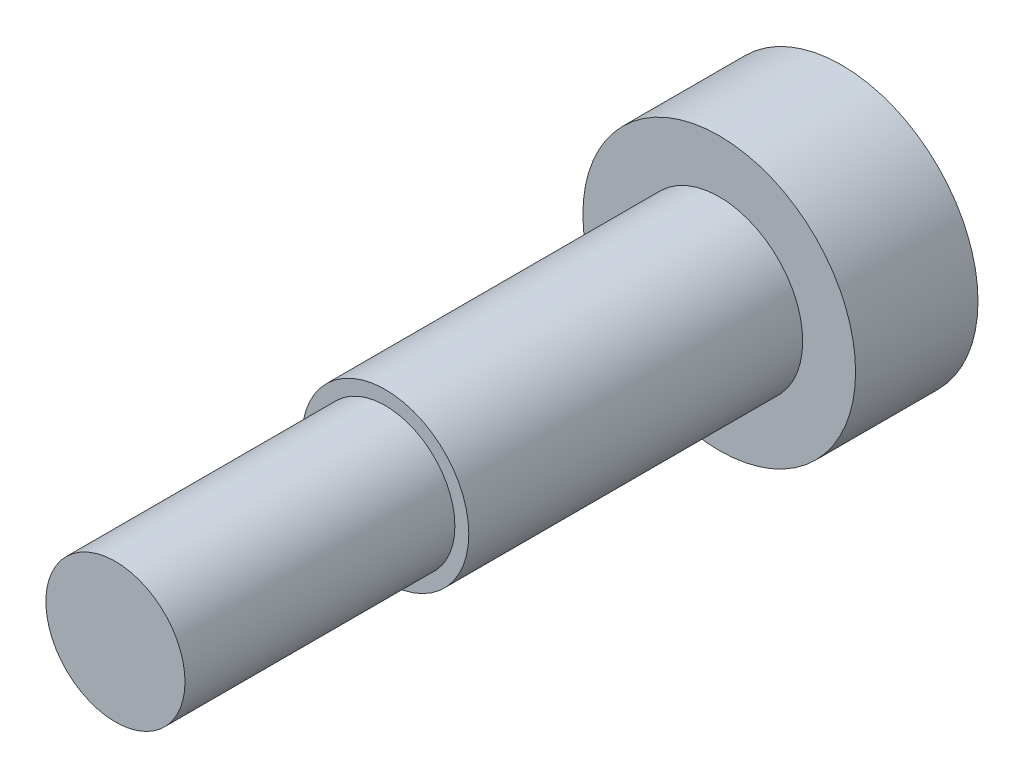
ISO-10303-21;
HEADER;
FILE_DESCRIPTION(('STEP AP214'),'2;1');
FILE_NAME('part.step','',(''),(''),'','','');
FILE_SCHEMA(('AUTOMOTIVE_DESIGN { 1 0 10303 214 1 1 1 1 }'));
ENDSEC;
DATA;
#1=APPLICATION_CONTEXT('core data for automotive mechanical design processes');
#2=APPLICATION_PROTOCOL_DEFINITION('international standard','automotive_design',2000,#1);
#3=PRODUCT_CONTEXT('',#1,'mechanical');
#4=PRODUCT('Part','Part','',(#3));
#5=PRODUCT_RELATED_PRODUCT_CATEGORY('part','',(#4));
#6=PRODUCT_DEFINITION_FORMATION('','',#4);
#7=PRODUCT_DEFINITION_CONTEXT('part definition',#1,'design');
#8=PRODUCT_DEFINITION('design','',#6,#7);
#9=PRODUCT_DEFINITION_SHAPE('','',#8);
#10=(LENGTH_UNIT() NAMED_UNIT(*) SI_UNIT(.MILLI.,.METRE.));
#11=(NAMED_UNIT(*) PLANE_ANGLE_UNIT() SI_UNIT($,.RADIAN.));
#12=(NAMED_UNIT(*) SI_UNIT($,.STERADIAN.) SOLID_ANGLE_UNIT());
#13=UNCERTAINTY_MEASURE_WITH_UNIT(LENGTH_MEASURE(1.E-05),#10,'distance_accuracy_value','');
#14=(GEOMETRIC_REPRESENTATION_CONTEXT(3) GLOBAL_UNCERTAINTY_ASSIGNED_CONTEXT((#13)) GLOBAL_UNIT_ASSIGNED_CONTEXT((#10,
#11,#12)) REPRESENTATION_CONTEXT('',''));
#15=CARTESIAN_POINT('',(0.,0.,0.));
#16=DIRECTION('',(0.,0.,1.));
#17=DIRECTION('',(1.,0.,0.));
#18=AXIS2_PLACEMENT_3D('',#15,#16,#17);
#19=CARTESIAN_POINT('',(0.,0.,4.4));
#20=DIRECTION('',(0.,0.,-1.));
#21=DIRECTION('',(-1.,0.,0.));
#22=AXIS2_PLACEMENT_3D('',#19,#20,#21);
#23=CYLINDRICAL_SURFACE('',#22,4.9);
#24=CARTESIAN_POINT('',(0.,0.,4.4));
#25=DIRECTION('',(0.,0.,1.));
#26=DIRECTION('',(1.,0.,0.));
#27=AXIS2_PLACEMENT_3D('',#24,#25,#26);
#28=CIRCLE('',#27,4.9);
#29=CARTESIAN_POINT('',(4.9,0.,4.4));
#30=VERTEX_POINT('',#29);
#31=EDGE_CURVE('E152',#30,#30,#28,.T.);
#32=ORIENTED_EDGE('',*,*,#31,.F.);
#33=EDGE_LOOP('',(#32));
#34=FACE_BOUND('',#33,.T.);
#35=CARTESIAN_POINT('',(0.,0.,0.));
#36=DIRECTION('',(0.,0.,1.));
#37=DIRECTION('',(1.,0.,0.));
#38=AXIS2_PLACEMENT_3D('',#35,#36,#37);
#39=CIRCLE('',#38,4.9);
#40=CARTESIAN_POINT('',(4.9,0.,0.));
#41=VERTEX_POINT('',#40);
#42=EDGE_CURVE('E40',#41,#41,#39,.T.);
#43=ORIENTED_EDGE('',*,*,#42,.T.);
#44=EDGE_LOOP('',(#43));
#45=FACE_BOUND('',#44,.T.);
#46=ADVANCED_FACE('F37',(#34,#45),#23,.T.);
#47=CARTESIAN_POINT('',(0.,0.,4.4));
#48=DIRECTION('',(0.,0.,1.));
#49=DIRECTION('',(1.,0.,0.));
#50=AXIS2_PLACEMENT_3D('',#47,#48,#49);
#51=PLANE('',#50);
#52=CARTESIAN_POINT('',(0.,0.,4.4));
#53=DIRECTION('',(0.,0.,1.));
#54=DIRECTION('',(1.,0.,0.));
#55=AXIS2_PLACEMENT_3D('',#52,#53,#54);
#56=CIRCLE('',#55,3.);
#57=CARTESIAN_POINT('',(3.,0.,4.4));
#58=VERTEX_POINT('',#57);
#59=EDGE_CURVE('E45',#58,#58,#56,.T.);
#60=ORIENTED_EDGE('',*,*,#59,.F.);
#61=EDGE_LOOP('',(#60));
#62=FACE_BOUND('',#61,.T.);
#63=ORIENTED_EDGE('',*,*,#31,.T.);
#64=EDGE_LOOP('',(#63));
#65=FACE_BOUND('',#64,.T.);
#66=ADVANCED_FACE('F163',(#62,#65),#51,.T.);
#67=CARTESIAN_POINT('',(0.,0.,0.));
#68=DIRECTION('',(0.,0.,1.));
#69=DIRECTION('',(1.,0.,0.));
#70=AXIS2_PLACEMENT_3D('',#67,#68,#69);
#71=PLANE('',#70);
#72=DIRECTION('',(0.866025403784439,-0.5,0.));
#73=VECTOR('',#72,1.);
#74=CARTESIAN_POINT('',(0.,1.73205080756888,0.));
#75=LINE('',#74,#73);
#76=CARTESIAN_POINT('',(0.,1.73205080756888,0.));
#77=VERTEX_POINT('',#76);
#78=CARTESIAN_POINT('',(1.5,0.866025403784438,0.));
#79=VERTEX_POINT('',#78);
#80=EDGE_CURVE('E127',#77,#79,#75,.T.);
#81=ORIENTED_EDGE('',*,*,#80,.F.);
#82=DIRECTION('',(0.866025403784439,0.5,0.));
#83=VECTOR('',#82,1.);
#84=CARTESIAN_POINT('',(-1.5,0.866025403784439,0.));
#85=LINE('',#84,#83);
#86=CARTESIAN_POINT('',(-1.5,0.866025403784439,0.));
#87=VERTEX_POINT('',#86);
#88=EDGE_CURVE('E53',#87,#77,#85,.T.);
#89=ORIENTED_EDGE('',*,*,#88,.F.);
#90=DIRECTION('',(0.,1.,0.));
#91=VECTOR('',#90,1.);
#92=CARTESIAN_POINT('',(-1.5,-0.866025403784441,0.));
#93=LINE('',#92,#91);
#94=CARTESIAN_POINT('',(-1.5,-0.866025403784441,0.));
#95=VERTEX_POINT('',#94);
#96=EDGE_CURVE('E136',#95,#87,#93,.T.);
#97=ORIENTED_EDGE('',*,*,#96,.F.);
#98=DIRECTION('',(-0.866025403784439,0.5,0.));
#99=VECTOR('',#98,1.);
#100=CARTESIAN_POINT('',(0.,-1.73205080756888,0.));
#101=LINE('',#100,#99);
#102=CARTESIAN_POINT('',(0.,-1.73205080756888,0.));
#103=VERTEX_POINT('',#102);
#104=EDGE_CURVE('E134',#103,#95,#101,.T.);
#105=ORIENTED_EDGE('',*,*,#104,.F.);
#106=DIRECTION('',(-0.866025403784438,-0.5,0.));
#107=VECTOR('',#106,1.);
#108=CARTESIAN_POINT('',(1.5,-0.86602540378444,0.));
#109=LINE('',#108,#107);
#110=CARTESIAN_POINT('',(1.5,-0.86602540378444,0.));
#111=VERTEX_POINT('',#110);
#112=EDGE_CURVE('E101',#111,#103,#109,.T.);
#113=ORIENTED_EDGE('',*,*,#112,.F.);
#114=DIRECTION('',(0.,-1.,0.));
#115=VECTOR('',#114,1.);
#116=CARTESIAN_POINT('',(1.5,0.866025403784438,0.));
#117=LINE('',#116,#115);
#118=EDGE_CURVE('E130',#79,#111,#117,.T.);
#119=ORIENTED_EDGE('',*,*,#118,.F.);
#120=EDGE_LOOP('',(#81,#89,#97,#105,#113,#119));
#121=FACE_BOUND('',#120,.T.);
#122=ORIENTED_EDGE('',*,*,#42,.F.);
#123=EDGE_LOOP('',(#122));
#124=FACE_BOUND('',#123,.T.);
#125=ADVANCED_FACE('F160',(#121,#124),#71,.F.);
#126=CARTESIAN_POINT('',(0.,0.,16.4));
#127=DIRECTION('',(0.,0.,-1.));
#128=DIRECTION('',(-1.,0.,0.));
#129=AXIS2_PLACEMENT_3D('',#126,#127,#128);
#130=CYLINDRICAL_SURFACE('',#129,3.);
#131=CARTESIAN_POINT('',(0.,0.,16.4));
#132=DIRECTION('',(0.,0.,1.));
#133=DIRECTION('',(1.,0.,0.));
#134=AXIS2_PLACEMENT_3D('',#131,#132,#133);
#135=CIRCLE('',#134,3.);
#136=CARTESIAN_POINT('',(3.,0.,16.4));
#137=VERTEX_POINT('',#136);
#138=EDGE_CURVE('E147',#137,#137,#135,.T.);
#139=ORIENTED_EDGE('',*,*,#138,.F.);
#140=EDGE_LOOP('',(#139));
#141=FACE_BOUND('',#140,.T.);
#142=ORIENTED_EDGE('',*,*,#59,.T.);
#143=EDGE_LOOP('',(#142));
#144=FACE_BOUND('',#143,.T.);
#145=ADVANCED_FACE('F162',(#141,#144),#130,.T.);
#146=CARTESIAN_POINT('',(0.,0.,16.4));
#147=DIRECTION('',(0.,0.,1.));
#148=DIRECTION('',(1.,0.,0.));
#149=AXIS2_PLACEMENT_3D('',#146,#147,#148);
#150=PLANE('',#149);
#151=CARTESIAN_POINT('',(0.,0.,16.4));
#152=DIRECTION('',(0.,0.,1.));
#153=DIRECTION('',(1.,0.,0.));
#154=AXIS2_PLACEMENT_3D('',#151,#152,#153);
#155=CIRCLE('',#154,2.5);
#156=CARTESIAN_POINT('',(2.5,0.,16.4));
#157=VERTEX_POINT('',#156);
#158=EDGE_CURVE('E11',#157,#157,#155,.T.);
#159=ORIENTED_EDGE('',*,*,#158,.F.);
#160=EDGE_LOOP('',(#159));
#161=FACE_BOUND('',#160,.T.);
#162=ORIENTED_EDGE('',*,*,#138,.T.);
#163=EDGE_LOOP('',(#162));
#164=FACE_BOUND('',#163,.T.);
#165=ADVANCED_FACE('F170',(#161,#164),#150,.T.);
#166=CARTESIAN_POINT('',(0.,0.,26.1));
#167=DIRECTION('',(0.,0.,-1.));
#168=DIRECTION('',(-1.,0.,0.));
#169=AXIS2_PLACEMENT_3D('',#166,#167,#168);
#170=CYLINDRICAL_SURFACE('',#169,2.5);
#171=CARTESIAN_POINT('',(0.,0.,26.1));
#172=DIRECTION('',(0.,0.,1.));
#173=DIRECTION('',(1.,0.,0.));
#174=AXIS2_PLACEMENT_3D('',#171,#172,#173);
#175=CIRCLE('',#174,2.5);
#176=CARTESIAN_POINT('',(2.5,0.,26.1));
#177=VERTEX_POINT('',#176);
#178=EDGE_CURVE('E140',#177,#177,#175,.T.);
#179=ORIENTED_EDGE('',*,*,#178,.F.);
#180=EDGE_LOOP('',(#179));
#181=FACE_BOUND('',#180,.T.);
#182=ORIENTED_EDGE('',*,*,#158,.T.);
#183=EDGE_LOOP('',(#182));
#184=FACE_BOUND('',#183,.T.);
#185=ADVANCED_FACE('F195',(#181,#184),#170,.T.);
#186=CARTESIAN_POINT('',(0.,0.,26.1));
#187=DIRECTION('',(0.,0.,1.));
#188=DIRECTION('',(1.,0.,0.));
#189=AXIS2_PLACEMENT_3D('',#186,#187,#188);
#190=PLANE('',#189);
#191=ORIENTED_EDGE('',*,*,#178,.T.);
#192=EDGE_LOOP('',(#191));
#193=FACE_BOUND('',#192,.T.);
#194=ADVANCED_FACE('F202',(#193),#190,.T.);
#195=CARTESIAN_POINT('',(-1.5,0.866025403784439,2.));
#196=DIRECTION('',(-0.5,0.866025403784439,0.));
#197=DIRECTION('',(-0.866025403784439,-0.5,0.));
#198=AXIS2_PLACEMENT_3D('',#195,#196,#197);
#199=PLANE('',#198);
#200=ORIENTED_EDGE('',*,*,#88,.T.);
#201=DIRECTION('',(0.,0.,-1.));
#202=VECTOR('',#201,1.);
#203=CARTESIAN_POINT('',(0.,1.73205080756888,2.));
#204=LINE('',#203,#202);
#205=CARTESIAN_POINT('',(0.,1.73205080756888,2.));
#206=VERTEX_POINT('',#205);
#207=EDGE_CURVE('E83',#206,#77,#204,.T.);
#208=ORIENTED_EDGE('',*,*,#207,.F.);
#209=DIRECTION('',(0.866025403784439,0.5,0.));
#210=VECTOR('',#209,1.);
#211=CARTESIAN_POINT('',(-1.5,0.866025403784439,2.));
#212=LINE('',#211,#210);
#213=CARTESIAN_POINT('',(-1.5,0.866025403784439,2.));
#214=VERTEX_POINT('',#213);
#215=EDGE_CURVE('E138',#214,#206,#212,.T.);
#216=ORIENTED_EDGE('',*,*,#215,.F.);
#217=DIRECTION('',(0.,0.,-1.));
#218=VECTOR('',#217,1.);
#219=CARTESIAN_POINT('',(-1.5,0.866025403784439,2.));
#220=LINE('',#219,#218);
#221=EDGE_CURVE('E61',#214,#87,#220,.T.);
#222=ORIENTED_EDGE('',*,*,#221,.T.);
#223=EDGE_LOOP('',(#200,#208,#216,#222));
#224=FACE_BOUND('',#223,.T.);
#225=ADVANCED_FACE('F209',(#224),#199,.F.);
#226=CARTESIAN_POINT('',(-1.5,-0.866025403784441,2.));
#227=DIRECTION('',(-1.,0.,0.));
#228=DIRECTION('',(0.,0.,1.));
#229=AXIS2_PLACEMENT_3D('',#226,#227,#228);
#230=PLANE('',#229);
#231=ORIENTED_EDGE('',*,*,#96,.T.);
#232=ORIENTED_EDGE('',*,*,#221,.F.);
#233=DIRECTION('',(0.,1.,0.));
#234=VECTOR('',#233,1.);
#235=CARTESIAN_POINT('',(-1.5,-0.866025403784441,2.));
#236=LINE('',#235,#234);
#237=CARTESIAN_POINT('',(-1.5,-0.866025403784441,2.));
#238=VERTEX_POINT('',#237);
#239=EDGE_CURVE('E113',#238,#214,#236,.T.);
#240=ORIENTED_EDGE('',*,*,#239,.F.);
#241=DIRECTION('',(0.,0.,-1.));
#242=VECTOR('',#241,1.);
#243=CARTESIAN_POINT('',(-1.5,-0.866025403784441,2.));
#244=LINE('',#243,#242);
#245=EDGE_CURVE('E105',#238,#95,#244,.T.);
#246=ORIENTED_EDGE('',*,*,#245,.T.);
#247=EDGE_LOOP('',(#231,#232,#240,#246));
#248=FACE_BOUND('',#247,.T.);
#249=ADVANCED_FACE('F218',(#248),#230,.F.);
#250=CARTESIAN_POINT('',(0.,-1.73205080756888,2.));
#251=DIRECTION('',(-0.5,-0.866025403784439,0.));
#252=DIRECTION('',(0.866025403784439,-0.5,0.));
#253=AXIS2_PLACEMENT_3D('',#250,#251,#252);
#254=PLANE('',#253);
#255=ORIENTED_EDGE('',*,*,#104,.T.);
#256=ORIENTED_EDGE('',*,*,#245,.F.);
#257=DIRECTION('',(-0.866025403784439,0.5,0.));
#258=VECTOR('',#257,1.);
#259=CARTESIAN_POINT('',(0.,-1.73205080756888,2.));
#260=LINE('',#259,#258);
#261=CARTESIAN_POINT('',(0.,-1.73205080756888,2.));
#262=VERTEX_POINT('',#261);
#263=EDGE_CURVE('E109',#262,#238,#260,.T.);
#264=ORIENTED_EDGE('',*,*,#263,.F.);
#265=DIRECTION('',(0.,0.,-1.));
#266=VECTOR('',#265,1.);
#267=CARTESIAN_POINT('',(0.,-1.73205080756888,2.));
#268=LINE('',#267,#266);
#269=EDGE_CURVE('E94',#262,#103,#268,.T.);
#270=ORIENTED_EDGE('',*,*,#269,.T.);
#271=EDGE_LOOP('',(#255,#256,#264,#270));
#272=FACE_BOUND('',#271,.T.);
#273=ADVANCED_FACE('F110',(#272),#254,.F.);
#274=CARTESIAN_POINT('',(1.5,-0.86602540378444,2.));
#275=DIRECTION('',(0.5,-0.866025403784438,0.));
#276=DIRECTION('',(0.866025403784439,0.5,0.));
#277=AXIS2_PLACEMENT_3D('',#274,#275,#276);
#278=PLANE('',#277);
#279=ORIENTED_EDGE('',*,*,#112,.T.);
#280=ORIENTED_EDGE('',*,*,#269,.F.);
#281=DIRECTION('',(-0.866025403784438,-0.5,0.));
#282=VECTOR('',#281,1.);
#283=CARTESIAN_POINT('',(1.5,-0.86602540378444,2.));
#284=LINE('',#283,#282);
#285=CARTESIAN_POINT('',(1.5,-0.86602540378444,2.));
#286=VERTEX_POINT('',#285);
#287=EDGE_CURVE('E98',#286,#262,#284,.T.);
#288=ORIENTED_EDGE('',*,*,#287,.F.);
#289=DIRECTION('',(0.,0.,-1.));
#290=VECTOR('',#289,1.);
#291=CARTESIAN_POINT('',(1.5,-0.86602540378444,2.));
#292=LINE('',#291,#290);
#293=EDGE_CURVE('E106',#286,#111,#292,.T.);
#294=ORIENTED_EDGE('',*,*,#293,.T.);
#295=EDGE_LOOP('',(#279,#280,#288,#294));
#296=FACE_BOUND('',#295,.T.);
#297=ADVANCED_FACE('F96',(#296),#278,.F.);
#298=CARTESIAN_POINT('',(1.5,0.866025403784438,2.));
#299=DIRECTION('',(1.,0.,0.));
#300=DIRECTION('',(0.,1.,0.));
#301=AXIS2_PLACEMENT_3D('',#298,#299,#300);
#302=PLANE('',#301);
#303=ORIENTED_EDGE('',*,*,#118,.T.);
#304=ORIENTED_EDGE('',*,*,#293,.F.);
#305=DIRECTION('',(0.,-1.,0.));
#306=VECTOR('',#305,1.);
#307=CARTESIAN_POINT('',(1.5,0.866025403784438,2.));
#308=LINE('',#307,#306);
#309=CARTESIAN_POINT('',(1.5,0.866025403784438,2.));
#310=VERTEX_POINT('',#309);
#311=EDGE_CURVE('E119',#310,#286,#308,.T.);
#312=ORIENTED_EDGE('',*,*,#311,.F.);
#313=DIRECTION('',(0.,0.,-1.));
#314=VECTOR('',#313,1.);
#315=CARTESIAN_POINT('',(1.5,0.866025403784438,2.));
#316=LINE('',#315,#314);
#317=EDGE_CURVE('E143',#310,#79,#316,.T.);
#318=ORIENTED_EDGE('',*,*,#317,.T.);
#319=EDGE_LOOP('',(#303,#304,#312,#318));
#320=FACE_BOUND('',#319,.T.);
#321=ADVANCED_FACE('F237',(#320),#302,.F.);
#322=CARTESIAN_POINT('',(0.,1.73205080756888,2.));
#323=DIRECTION('',(0.5,0.866025403784439,0.));
#324=DIRECTION('',(-0.866025403784439,0.5,0.));
#325=AXIS2_PLACEMENT_3D('',#322,#323,#324);
#326=PLANE('',#325);
#327=ORIENTED_EDGE('',*,*,#80,.T.);
#328=ORIENTED_EDGE('',*,*,#317,.F.);
#329=DIRECTION('',(0.866025403784439,-0.5,0.));
#330=VECTOR('',#329,1.);
#331=CARTESIAN_POINT('',(0.,1.73205080756888,2.));
#332=LINE('',#331,#330);
#333=EDGE_CURVE('E121',#206,#310,#332,.T.);
#334=ORIENTED_EDGE('',*,*,#333,.F.);
#335=ORIENTED_EDGE('',*,*,#207,.T.);
#336=EDGE_LOOP('',(#327,#328,#334,#335));
#337=FACE_BOUND('',#336,.T.);
#338=ADVANCED_FACE('F244',(#337),#326,.F.);
#339=CARTESIAN_POINT('',(0.,0.,2.));
#340=DIRECTION('',(0.,0.,-1.));
#341=DIRECTION('',(-1.,0.,0.));
#342=AXIS2_PLACEMENT_3D('',#339,#340,#341);
#343=PLANE('',#342);
#344=ORIENTED_EDGE('',*,*,#215,.T.);
#345=ORIENTED_EDGE('',*,*,#333,.T.);
#346=ORIENTED_EDGE('',*,*,#311,.T.);
#347=ORIENTED_EDGE('',*,*,#287,.T.);
#348=ORIENTED_EDGE('',*,*,#263,.T.);
#349=ORIENTED_EDGE('',*,*,#239,.T.);
#350=EDGE_LOOP('',(#344,#345,#346,#347,#348,#349));
#351=FACE_BOUND('',#350,.T.);
#352=ADVANCED_FACE('F116',(#351),#343,.T.);
#353=CLOSED_SHELL('',(#46,#66,#125,#145,#165,#185,#194,#225,#249,#273,#297,#321,#338,#352));
#354=MANIFOLD_SOLID_BREP('B2',#353);
#355=ADVANCED_BREP_SHAPE_REPRESENTATION('',(#18,#354),#14);
#356=SHAPE_DEFINITION_REPRESENTATION(#9,#355);
ENDSEC;
END-ISO-10303-21;
